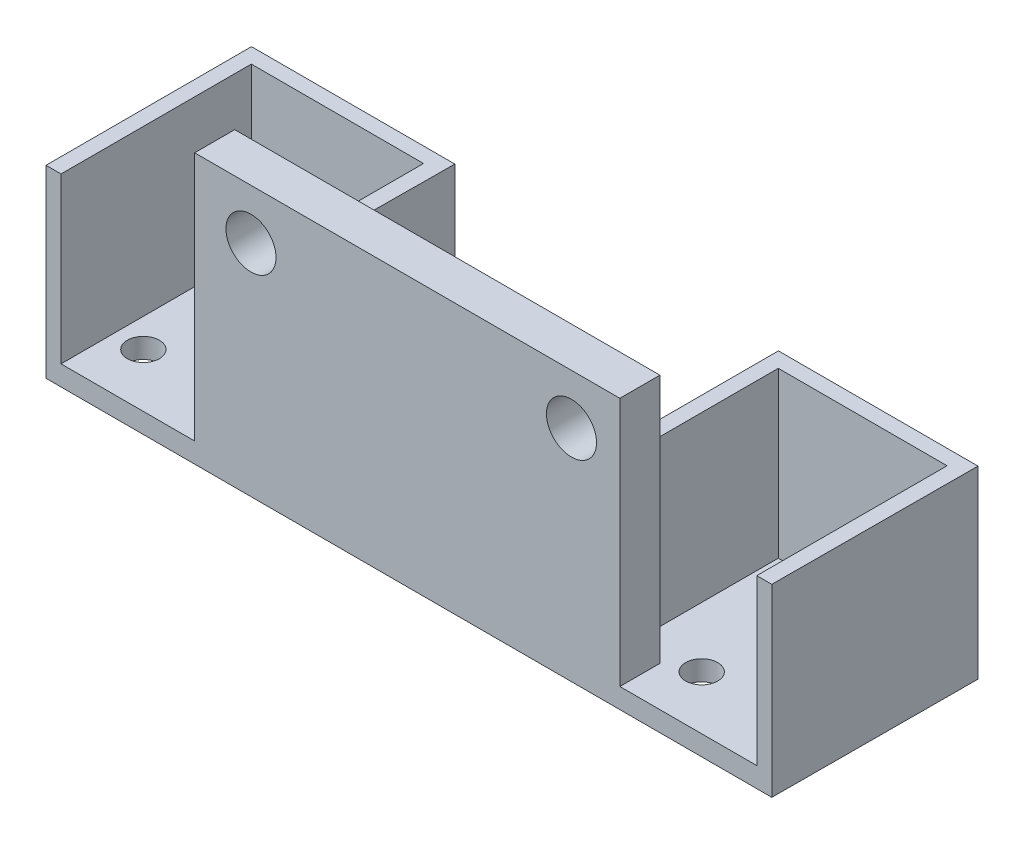
ISO-10303-21;
HEADER;
FILE_DESCRIPTION(('STEP AP214'),'2;1');
FILE_NAME('part.step','',(''),(''),'','','');
FILE_SCHEMA(('AUTOMOTIVE_DESIGN { 1 0 10303 214 1 1 1 1 }'));
ENDSEC;
DATA;
#1=APPLICATION_CONTEXT('core data for automotive mechanical design processes');
#2=APPLICATION_PROTOCOL_DEFINITION('international standard','automotive_design',2000,#1);
#3=PRODUCT_CONTEXT('',#1,'mechanical');
#4=PRODUCT('Part','Part','',(#3));
#5=PRODUCT_RELATED_PRODUCT_CATEGORY('part','',(#4));
#6=PRODUCT_DEFINITION_FORMATION('','',#4);
#7=PRODUCT_DEFINITION_CONTEXT('part definition',#1,'design');
#8=PRODUCT_DEFINITION('design','',#6,#7);
#9=PRODUCT_DEFINITION_SHAPE('','',#8);
#10=(LENGTH_UNIT() NAMED_UNIT(*) SI_UNIT(.MILLI.,.METRE.));
#11=(NAMED_UNIT(*) PLANE_ANGLE_UNIT() SI_UNIT($,.RADIAN.));
#12=(NAMED_UNIT(*) SI_UNIT($,.STERADIAN.) SOLID_ANGLE_UNIT());
#13=UNCERTAINTY_MEASURE_WITH_UNIT(LENGTH_MEASURE(1.E-05),#10,'distance_accuracy_value','');
#14=(GEOMETRIC_REPRESENTATION_CONTEXT(3) GLOBAL_UNCERTAINTY_ASSIGNED_CONTEXT((#13)) GLOBAL_UNIT_ASSIGNED_CONTEXT((#10,
#11,#12)) REPRESENTATION_CONTEXT('',''));
#15=CARTESIAN_POINT('',(0.,0.,0.));
#16=DIRECTION('',(0.,0.,1.));
#17=DIRECTION('',(1.,0.,0.));
#18=AXIS2_PLACEMENT_3D('',#15,#16,#17);
#19=CARTESIAN_POINT('',(0.,0.,6.));
#20=DIRECTION('',(0.,0.,1.));
#21=DIRECTION('',(1.,0.,0.));
#22=AXIS2_PLACEMENT_3D('',#19,#20,#21);
#23=PLANE('',#22);
#24=DIRECTION('',(0.,1.,0.));
#25=VECTOR('',#24,1.);
#26=CARTESIAN_POINT('',(9.99999999999998,-45.5,6.));
#27=LINE('',#26,#25);
#28=CARTESIAN_POINT('',(9.99999999999998,-35.9221877684383,6.));
#29=VERTEX_POINT('',#28);
#30=CARTESIAN_POINT('',(9.99999999999998,-17.5,6.));
#31=VERTEX_POINT('',#30);
#32=EDGE_CURVE('E383',#29,#31,#27,.T.);
#33=ORIENTED_EDGE('',*,*,#32,.T.);
#34=DIRECTION('',(-1.,0.,0.));
#35=VECTOR('',#34,1.);
#36=CARTESIAN_POINT('',(11.5,-17.5,6.));
#37=LINE('',#36,#35);
#38=CARTESIAN_POINT('',(8.49999999999998,-17.5,6.));
#39=VERTEX_POINT('',#38);
#40=EDGE_CURVE('E267',#31,#39,#37,.T.);
#41=ORIENTED_EDGE('',*,*,#40,.T.);
#42=DIRECTION('',(0.,-1.,0.));
#43=VECTOR('',#42,1.);
#44=CARTESIAN_POINT('',(8.49999999999998,-17.5,6.));
#45=LINE('',#44,#43);
#46=CARTESIAN_POINT('',(8.49999999999998,-33.9221877684383,6.));
#47=VERTEX_POINT('',#46);
#48=EDGE_CURVE('E261',#39,#47,#45,.T.);
#49=ORIENTED_EDGE('',*,*,#48,.T.);
#50=DIRECTION('',(-1.,0.,0.));
#51=VECTOR('',#50,1.);
#52=CARTESIAN_POINT('',(11.5,-33.9221877684383,6.));
#53=LINE('',#52,#51);
#54=CARTESIAN_POINT('',(-5.17053766501618,-33.9221877684383,6.));
#55=VERTEX_POINT('',#54);
#56=EDGE_CURVE('E258',#47,#55,#53,.T.);
#57=ORIENTED_EDGE('',*,*,#56,.T.);
#58=DIRECTION('',(0.,-1.,0.));
#59=VECTOR('',#58,1.);
#60=CARTESIAN_POINT('',(-5.17053766501618,0.,6.));
#61=LINE('',#60,#59);
#62=CARTESIAN_POINT('',(-5.17053766501618,-9.,6.));
#63=VERTEX_POINT('',#62);
#64=EDGE_CURVE('E285',#63,#55,#61,.T.);
#65=ORIENTED_EDGE('',*,*,#64,.F.);
#66=DIRECTION('',(-1.,0.,0.));
#67=VECTOR('',#66,1.);
#68=CARTESIAN_POINT('',(0.,-9.,6.));
#69=LINE('',#68,#67);
#70=CARTESIAN_POINT('',(-47.6233672567332,-9.,6.));
#71=VERTEX_POINT('',#70);
#72=EDGE_CURVE('E260',#63,#71,#69,.T.);
#73=ORIENTED_EDGE('',*,*,#72,.T.);
#74=DIRECTION('',(0.,-1.,0.));
#75=VECTOR('',#74,1.);
#76=CARTESIAN_POINT('',(-47.6233672567332,0.,6.));
#77=LINE('',#76,#75);
#78=CARTESIAN_POINT('',(-47.6233672567332,-33.9221877684383,6.));
#79=VERTEX_POINT('',#78);
#80=EDGE_CURVE('E296',#71,#79,#77,.T.);
#81=ORIENTED_EDGE('',*,*,#80,.T.);
#82=DIRECTION('',(-1.,0.,0.));
#83=VECTOR('',#82,1.);
#84=CARTESIAN_POINT('',(-40.7736847014026,-33.9221877684383,6.));
#85=LINE('',#84,#83);
#86=CARTESIAN_POINT('',(-60.9659308763604,-33.9221877684383,6.));
#87=VERTEX_POINT('',#86);
#88=EDGE_CURVE('E40',#79,#87,#85,.T.);
#89=ORIENTED_EDGE('',*,*,#88,.T.);
#90=DIRECTION('',(0.,1.,0.));
#91=VECTOR('',#90,1.);
#92=CARTESIAN_POINT('',(-60.9659308763604,-33.9221877684383,6.));
#93=LINE('',#92,#91);
#94=CARTESIAN_POINT('',(-60.9659308763604,-17.5,6.));
#95=VERTEX_POINT('',#94);
#96=EDGE_CURVE('E262',#87,#95,#93,.T.);
#97=ORIENTED_EDGE('',*,*,#96,.T.);
#98=DIRECTION('',(-1.,0.,0.));
#99=VECTOR('',#98,1.);
#100=CARTESIAN_POINT('',(-60.9659308763604,-17.5,6.));
#101=LINE('',#100,#99);
#102=CARTESIAN_POINT('',(-62.4659308763604,-17.5,6.));
#103=VERTEX_POINT('',#102);
#104=EDGE_CURVE('E265',#95,#103,#101,.T.);
#105=ORIENTED_EDGE('',*,*,#104,.T.);
#106=DIRECTION('',(0.,1.,0.));
#107=VECTOR('',#106,1.);
#108=CARTESIAN_POINT('',(-62.4659308763604,-45.5,6.));
#109=LINE('',#108,#107);
#110=CARTESIAN_POINT('',(-62.4659308763604,-35.9221877684383,6.));
#111=VERTEX_POINT('',#110);
#112=EDGE_CURVE('E45',#111,#103,#109,.T.);
#113=ORIENTED_EDGE('',*,*,#112,.F.);
#114=DIRECTION('',(-1.,0.,0.));
#115=VECTOR('',#114,1.);
#116=CARTESIAN_POINT('',(-40.7736847014026,-35.9221877684383,6.));
#117=LINE('',#116,#115);
#118=EDGE_CURVE('E182',#29,#111,#117,.T.);
#119=ORIENTED_EDGE('',*,*,#118,.F.);
#120=EDGE_LOOP('',(#33,#41,#49,#57,#65,#73,#81,#89,#97,#105,#113,#119));
#121=FACE_BOUND('',#120,.T.);
#122=CARTESIAN_POINT('',(-10.,-14.,6.));
#123=DIRECTION('',(0.,0.,1.));
#124=DIRECTION('',(1.,0.,0.));
#125=AXIS2_PLACEMENT_3D('',#122,#123,#124);
#126=CIRCLE('',#125,2.5);
#127=CARTESIAN_POINT('',(-7.5,-14.,6.));
#128=VERTEX_POINT('',#127);
#129=EDGE_CURVE('E199',#128,#128,#126,.F.);
#130=ORIENTED_EDGE('',*,*,#129,.T.);
#131=EDGE_LOOP('',(#130));
#132=FACE_BOUND('',#131,.T.);
#133=CARTESIAN_POINT('',(-42.,-14.,6.));
#134=DIRECTION('',(0.,0.,1.));
#135=DIRECTION('',(1.,0.,0.));
#136=AXIS2_PLACEMENT_3D('',#133,#134,#135);
#137=CIRCLE('',#136,2.5);
#138=CARTESIAN_POINT('',(-39.5,-14.,6.));
#139=VERTEX_POINT('',#138);
#140=EDGE_CURVE('E192',#139,#139,#137,.F.);
#141=ORIENTED_EDGE('',*,*,#140,.T.);
#142=EDGE_LOOP('',(#141));
#143=FACE_BOUND('',#142,.T.);
#144=ADVANCED_FACE('F36',(#121,#132,#143),#23,.T.);
#145=CARTESIAN_POINT('',(0.,-35.9221877684383,0.));
#146=DIRECTION('',(0.,-1.,0.));
#147=DIRECTION('',(0.,0.,-1.));
#148=AXIS2_PLACEMENT_3D('',#145,#146,#147);
#149=PLANE('',#148);
#150=DIRECTION('',(1.,0.,0.));
#151=VECTOR('',#150,1.);
#152=CARTESIAN_POINT('',(-40.7736847014026,-35.9221877684383,2.));
#153=LINE('',#152,#151);
#154=CARTESIAN_POINT('',(-42.2736847014026,-35.9221877684383,2.));
#155=VERTEX_POINT('',#154);
#156=CARTESIAN_POINT('',(-9.85494084252542,-35.9221877684383,2.));
#157=VERTEX_POINT('',#156);
#158=EDGE_CURVE('E184',#155,#157,#153,.T.);
#159=ORIENTED_EDGE('',*,*,#158,.T.);
#160=DIRECTION('',(0.,0.,1.));
#161=VECTOR('',#160,1.);
#162=CARTESIAN_POINT('',(-9.85494084252542,-35.9221877684383,0.));
#163=LINE('',#162,#161);
#164=CARTESIAN_POINT('',(-9.85494084252542,-35.9221877684383,-14.515404627564));
#165=VERTEX_POINT('',#164);
#166=EDGE_CURVE('E401',#165,#157,#163,.T.);
#167=ORIENTED_EDGE('',*,*,#166,.F.);
#168=DIRECTION('',(-1.,0.,0.));
#169=VECTOR('',#168,1.);
#170=CARTESIAN_POINT('',(0.,-35.9221877684383,-14.515404627564));
#171=LINE('',#170,#169);
#172=CARTESIAN_POINT('',(10.0714952975409,-35.9221877684383,-14.515404627564));
#173=VERTEX_POINT('',#172);
#174=EDGE_CURVE('E268',#173,#165,#171,.T.);
#175=ORIENTED_EDGE('',*,*,#174,.F.);
#176=DIRECTION('',(0.0034849355735506,0.,-0.999993927593587));
#177=VECTOR('',#176,1.);
#178=CARTESIAN_POINT('',(10.0207880387101,-35.9221877684383,0.0349220127717654));
#179=LINE('',#178,#177);
#180=EDGE_CURVE('E409',#29,#173,#179,.T.);
#181=ORIENTED_EDGE('',*,*,#180,.F.);
#182=ORIENTED_EDGE('',*,*,#118,.T.);
#183=DIRECTION('',(0.,0.,1.));
#184=VECTOR('',#183,1.);
#185=CARTESIAN_POINT('',(-62.4659308763604,-35.9221877684383,0.));
#186=LINE('',#185,#184);
#187=CARTESIAN_POINT('',(-62.4659308763604,-35.9221877684383,-14.515404627564));
#188=VERTEX_POINT('',#187);
#189=EDGE_CURVE('E177',#188,#111,#186,.T.);
#190=ORIENTED_EDGE('',*,*,#189,.F.);
#191=DIRECTION('',(-1.,0.,0.));
#192=VECTOR('',#191,1.);
#193=CARTESIAN_POINT('',(0.,-35.9221877684383,-14.515404627564));
#194=LINE('',#193,#192);
#195=CARTESIAN_POINT('',(-42.1602495844985,-35.9221877684383,-14.515404627564));
#196=VERTEX_POINT('',#195);
#197=EDGE_CURVE('E164',#196,#188,#194,.T.);
#198=ORIENTED_EDGE('',*,*,#197,.F.);
#199=DIRECTION('',(0.00686828109131985,0.,-0.999976413079254));
#200=VECTOR('',#199,1.);
#201=CARTESIAN_POINT('',(-42.2579542746405,-35.9221877684383,-0.290246354320128));
#202=LINE('',#201,#200);
#203=EDGE_CURVE('E207',#155,#196,#202,.T.);
#204=ORIENTED_EDGE('',*,*,#203,.F.);
#205=EDGE_LOOP('',(#159,#167,#175,#181,#182,#190,#198,#204));
#206=FACE_BOUND('',#205,.T.);
#207=CARTESIAN_POINT('',(-49.7736847014026,-35.9221877684383,0.643335212018568));
#208=DIRECTION('',(0.,-1.,0.));
#209=DIRECTION('',(0.,0.,-1.));
#210=AXIS2_PLACEMENT_3D('',#207,#208,#209);
#211=CIRCLE('',#210,1.6);
#212=CARTESIAN_POINT('',(-49.7736847014026,-35.9221877684383,-0.95666478798143));
#213=VERTEX_POINT('',#212);
#214=EDGE_CURVE('E209',#213,#213,#211,.T.);
#215=ORIENTED_EDGE('',*,*,#214,.F.);
#216=EDGE_LOOP('',(#215));
#217=FACE_BOUND('',#216,.T.);
#218=CARTESIAN_POINT('',(-58.1024837437839,-35.9221877684383,0.643335212018568));
#219=DIRECTION('',(0.,-1.,0.));
#220=DIRECTION('',(0.,0.,-1.));
#221=AXIS2_PLACEMENT_3D('',#218,#219,#220);
#222=CIRCLE('',#221,1.6);
#223=CARTESIAN_POINT('',(-58.1024837437839,-35.9221877684383,-0.95666478798143));
#224=VERTEX_POINT('',#223);
#225=EDGE_CURVE('E222',#224,#224,#222,.T.);
#226=ORIENTED_EDGE('',*,*,#225,.F.);
#227=EDGE_LOOP('',(#226));
#228=FACE_BOUND('',#227,.T.);
#229=CARTESIAN_POINT('',(5.49999999999998,-35.9221877684383,0.643335212018568));
#230=DIRECTION('',(0.,-1.,0.));
#231=DIRECTION('',(0.,0.,-1.));
#232=AXIS2_PLACEMENT_3D('',#229,#230,#231);
#233=CIRCLE('',#232,1.6);
#234=CARTESIAN_POINT('',(5.49999999999998,-35.9221877684383,-0.956664787981432));
#235=VERTEX_POINT('',#234);
#236=EDGE_CURVE('E203',#235,#235,#233,.T.);
#237=ORIENTED_EDGE('',*,*,#236,.F.);
#238=EDGE_LOOP('',(#237));
#239=FACE_BOUND('',#238,.T.);
#240=CARTESIAN_POINT('',(-2.35494084252542,-35.9221877684383,0.643335212018568));
#241=DIRECTION('',(0.,-1.,0.));
#242=DIRECTION('',(0.,0.,-1.));
#243=AXIS2_PLACEMENT_3D('',#240,#241,#242);
#244=CIRCLE('',#243,1.6);
#245=CARTESIAN_POINT('',(-2.35494084252542,-35.9221877684383,-0.956664787981432));
#246=VERTEX_POINT('',#245);
#247=EDGE_CURVE('E219',#246,#246,#244,.T.);
#248=ORIENTED_EDGE('',*,*,#247,.F.);
#249=EDGE_LOOP('',(#248));
#250=FACE_BOUND('',#249,.T.);
#251=ADVANCED_FACE('F412',(#206,#217,#228,#239,#250),#149,.T.);
#252=CARTESIAN_POINT('',(0.,-33.9221877684383,0.));
#253=DIRECTION('',(0.,-1.,0.));
#254=DIRECTION('',(0.,0.,-1.));
#255=AXIS2_PLACEMENT_3D('',#252,#253,#254);
#256=PLANE('',#255);
#257=CARTESIAN_POINT('',(5.49999999999998,-33.9221877684383,0.643335212018568));
#258=DIRECTION('',(0.,-1.,0.));
#259=DIRECTION('',(0.,0.,-1.));
#260=AXIS2_PLACEMENT_3D('',#257,#258,#259);
#261=CIRCLE('',#260,1.6);
#262=CARTESIAN_POINT('',(5.49999999999998,-33.9221877684383,-0.956664787981432));
#263=VERTEX_POINT('',#262);
#264=EDGE_CURVE('E183',#263,#263,#261,.T.);
#265=ORIENTED_EDGE('',*,*,#264,.T.);
#266=EDGE_LOOP('',(#265));
#267=FACE_BOUND('',#266,.T.);
#268=CARTESIAN_POINT('',(-2.35494084252542,-33.9221877684383,0.643335212018568));
#269=DIRECTION('',(0.,-1.,0.));
#270=DIRECTION('',(0.,0.,-1.));
#271=AXIS2_PLACEMENT_3D('',#268,#269,#270);
#272=CIRCLE('',#271,1.6);
#273=CARTESIAN_POINT('',(-2.35494084252542,-33.9221877684383,-0.956664787981432));
#274=VERTEX_POINT('',#273);
#275=EDGE_CURVE('E189',#274,#274,#272,.T.);
#276=ORIENTED_EDGE('',*,*,#275,.T.);
#277=EDGE_LOOP('',(#276));
#278=FACE_BOUND('',#277,.T.);
#279=ORIENTED_EDGE('',*,*,#56,.F.);
#280=DIRECTION('',(0.,0.,-1.));
#281=VECTOR('',#280,1.);
#282=CARTESIAN_POINT('',(8.49999999999998,-33.9221877684383,-13.));
#283=LINE('',#282,#281);
#284=CARTESIAN_POINT('',(8.49999999999998,-33.9221877684383,-13.));
#285=VERTEX_POINT('',#284);
#286=EDGE_CURVE('E250',#47,#285,#283,.T.);
#287=ORIENTED_EDGE('',*,*,#286,.T.);
#288=DIRECTION('',(1.,0.,0.));
#289=VECTOR('',#288,1.);
#290=CARTESIAN_POINT('',(-80.6598893973896,-33.9221877684383,-13.));
#291=LINE('',#290,#289);
#292=CARTESIAN_POINT('',(-8.35494084252542,-33.9221877684383,-13.));
#293=VERTEX_POINT('',#292);
#294=EDGE_CURVE('E359',#293,#285,#291,.T.);
#295=ORIENTED_EDGE('',*,*,#294,.F.);
#296=DIRECTION('',(0.,0.,1.));
#297=VECTOR('',#296,1.);
#298=CARTESIAN_POINT('',(-8.35494084252542,-33.9221877684383,-13.));
#299=LINE('',#298,#297);
#300=CARTESIAN_POINT('',(-8.35494084252542,-33.9221877684383,2.));
#301=VERTEX_POINT('',#300);
#302=EDGE_CURVE('E245',#293,#301,#299,.T.);
#303=ORIENTED_EDGE('',*,*,#302,.T.);
#304=DIRECTION('',(1.,0.,0.));
#305=VECTOR('',#304,1.);
#306=CARTESIAN_POINT('',(0.,-33.9221877684383,2.));
#307=LINE('',#306,#305);
#308=CARTESIAN_POINT('',(-5.17053766501618,-33.9221877684383,2.));
#309=VERTEX_POINT('',#308);
#310=EDGE_CURVE('E239',#301,#309,#307,.T.);
#311=ORIENTED_EDGE('',*,*,#310,.T.);
#312=DIRECTION('',(0.,0.,-1.));
#313=VECTOR('',#312,1.);
#314=CARTESIAN_POINT('',(-5.17053766501618,-33.9221877684383,6.));
#315=LINE('',#314,#313);
#316=EDGE_CURVE('E253',#55,#309,#315,.T.);
#317=ORIENTED_EDGE('',*,*,#316,.F.);
#318=EDGE_LOOP('',(#279,#287,#295,#303,#311,#317));
#319=FACE_BOUND('',#318,.T.);
#320=ADVANCED_FACE('F280',(#267,#278,#319),#256,.F.);
#321=CARTESIAN_POINT('',(0.,-33.9221877684383,0.));
#322=DIRECTION('',(0.,-1.,0.));
#323=DIRECTION('',(0.,0.,-1.));
#324=AXIS2_PLACEMENT_3D('',#321,#322,#323);
#325=PLANE('',#324);
#326=CARTESIAN_POINT('',(-49.7736847014026,-33.9221877684383,0.643335212018568));
#327=DIRECTION('',(0.,-1.,0.));
#328=DIRECTION('',(0.,0.,-1.));
#329=AXIS2_PLACEMENT_3D('',#326,#327,#328);
#330=CIRCLE('',#329,1.6);
#331=CARTESIAN_POINT('',(-49.7736847014026,-33.9221877684383,-0.95666478798143));
#332=VERTEX_POINT('',#331);
#333=EDGE_CURVE('E237',#332,#332,#330,.T.);
#334=ORIENTED_EDGE('',*,*,#333,.T.);
#335=EDGE_LOOP('',(#334));
#336=FACE_BOUND('',#335,.T.);
#337=CARTESIAN_POINT('',(-58.1024837437839,-33.9221877684383,0.643335212018568));
#338=DIRECTION('',(0.,-1.,0.));
#339=DIRECTION('',(0.,0.,-1.));
#340=AXIS2_PLACEMENT_3D('',#337,#338,#339);
#341=CIRCLE('',#340,1.6);
#342=CARTESIAN_POINT('',(-58.1024837437839,-33.9221877684383,-0.95666478798143));
#343=VERTEX_POINT('',#342);
#344=EDGE_CURVE('E235',#343,#343,#341,.T.);
#345=ORIENTED_EDGE('',*,*,#344,.T.);
#346=EDGE_LOOP('',(#345));
#347=FACE_BOUND('',#346,.T.);
#348=DIRECTION('',(0.,0.,1.));
#349=VECTOR('',#348,1.);
#350=CARTESIAN_POINT('',(-60.9659308763604,-33.9221877684383,-13.));
#351=LINE('',#350,#349);
#352=CARTESIAN_POINT('',(-60.9659308763604,-33.9221877684383,-13.));
#353=VERTEX_POINT('',#352);
#354=EDGE_CURVE('E243',#353,#87,#351,.T.);
#355=ORIENTED_EDGE('',*,*,#354,.T.);
#356=ORIENTED_EDGE('',*,*,#88,.F.);
#357=DIRECTION('',(0.,0.,-1.));
#358=VECTOR('',#357,1.);
#359=CARTESIAN_POINT('',(-47.6233672567332,-33.9221877684383,6.));
#360=LINE('',#359,#358);
#361=CARTESIAN_POINT('',(-47.6233672567332,-33.9221877684383,2.));
#362=VERTEX_POINT('',#361);
#363=EDGE_CURVE('E319',#79,#362,#360,.T.);
#364=ORIENTED_EDGE('',*,*,#363,.T.);
#365=DIRECTION('',(1.,0.,0.));
#366=VECTOR('',#365,1.);
#367=CARTESIAN_POINT('',(0.,-33.9221877684383,2.));
#368=LINE('',#367,#366);
#369=CARTESIAN_POINT('',(-43.7736847014026,-33.9221877684383,2.));
#370=VERTEX_POINT('',#369);
#371=EDGE_CURVE('E321',#362,#370,#368,.T.);
#372=ORIENTED_EDGE('',*,*,#371,.T.);
#373=DIRECTION('',(0.,0.,-1.));
#374=VECTOR('',#373,1.);
#375=CARTESIAN_POINT('',(-43.7736847014026,-33.9221877684383,-13.));
#376=LINE('',#375,#374);
#377=CARTESIAN_POINT('',(-43.7736847014026,-33.9221877684383,-13.));
#378=VERTEX_POINT('',#377);
#379=EDGE_CURVE('E323',#370,#378,#376,.T.);
#380=ORIENTED_EDGE('',*,*,#379,.T.);
#381=EDGE_CURVE('E231',#353,#378,#291,.T.);
#382=ORIENTED_EDGE('',*,*,#381,.F.);
#383=EDGE_LOOP('',(#355,#356,#364,#372,#380,#382));
#384=FACE_BOUND('',#383,.T.);
#385=ADVANCED_FACE('F38',(#336,#347,#384),#325,.F.);
#386=CARTESIAN_POINT('',(0.,0.,2.));
#387=DIRECTION('',(0.,0.,1.));
#388=DIRECTION('',(1.,0.,0.));
#389=AXIS2_PLACEMENT_3D('',#386,#387,#388);
#390=PLANE('',#389);
#391=ORIENTED_EDGE('',*,*,#158,.F.);
#392=DIRECTION('',(0.,1.,0.));
#393=VECTOR('',#392,1.);
#394=CARTESIAN_POINT('',(-42.2736847014026,-45.5,2.));
#395=LINE('',#394,#393);
#396=CARTESIAN_POINT('',(-42.2736847014026,-17.5,2.));
#397=VERTEX_POINT('',#396);
#398=EDGE_CURVE('E208',#155,#397,#395,.T.);
#399=ORIENTED_EDGE('',*,*,#398,.T.);
#400=DIRECTION('',(1.,0.,0.));
#401=VECTOR('',#400,1.);
#402=CARTESIAN_POINT('',(-60.9659308763604,-17.5,2.));
#403=LINE('',#402,#401);
#404=CARTESIAN_POINT('',(-43.7736847014026,-17.5,2.));
#405=VERTEX_POINT('',#404);
#406=EDGE_CURVE('E314',#405,#397,#403,.T.);
#407=ORIENTED_EDGE('',*,*,#406,.F.);
#408=DIRECTION('',(0.,1.,0.));
#409=VECTOR('',#408,1.);
#410=CARTESIAN_POINT('',(-43.7736847014026,-17.5,2.));
#411=LINE('',#410,#409);
#412=EDGE_CURVE('E308',#370,#405,#411,.T.);
#413=ORIENTED_EDGE('',*,*,#412,.F.);
#414=ORIENTED_EDGE('',*,*,#371,.F.);
#415=DIRECTION('',(0.,-1.,0.));
#416=VECTOR('',#415,1.);
#417=CARTESIAN_POINT('',(-47.6233672567332,0.,2.));
#418=LINE('',#417,#416);
#419=CARTESIAN_POINT('',(-47.6233672567332,-9.,2.));
#420=VERTEX_POINT('',#419);
#421=EDGE_CURVE('E305',#420,#362,#418,.T.);
#422=ORIENTED_EDGE('',*,*,#421,.F.);
#423=DIRECTION('',(-1.,0.,0.));
#424=VECTOR('',#423,1.);
#425=CARTESIAN_POINT('',(0.,-9.,2.));
#426=LINE('',#425,#424);
#427=CARTESIAN_POINT('',(-5.17053766501618,-9.,2.));
#428=VERTEX_POINT('',#427);
#429=EDGE_CURVE('E301',#428,#420,#426,.T.);
#430=ORIENTED_EDGE('',*,*,#429,.F.);
#431=DIRECTION('',(0.,-1.,0.));
#432=VECTOR('',#431,1.);
#433=CARTESIAN_POINT('',(-5.17053766501618,0.,2.));
#434=LINE('',#433,#432);
#435=EDGE_CURVE('E289',#428,#309,#434,.T.);
#436=ORIENTED_EDGE('',*,*,#435,.T.);
#437=ORIENTED_EDGE('',*,*,#310,.F.);
#438=DIRECTION('',(0.,-1.,0.));
#439=VECTOR('',#438,1.);
#440=CARTESIAN_POINT('',(-8.35494084252542,-33.926569964251,2.));
#441=LINE('',#440,#439);
#442=CARTESIAN_POINT('',(-8.35494084252542,-17.5,2.));
#443=VERTEX_POINT('',#442);
#444=EDGE_CURVE('E287',#443,#301,#441,.T.);
#445=ORIENTED_EDGE('',*,*,#444,.F.);
#446=CARTESIAN_POINT('',(-9.85494084252542,-17.5,2.));
#447=VERTEX_POINT('',#446);
#448=EDGE_CURVE('E315',#447,#443,#403,.T.);
#449=ORIENTED_EDGE('',*,*,#448,.F.);
#450=DIRECTION('',(0.,1.,0.));
#451=VECTOR('',#450,1.);
#452=CARTESIAN_POINT('',(-9.85494084252542,-45.5,2.));
#453=LINE('',#452,#451);
#454=EDGE_CURVE('E410',#157,#447,#453,.T.);
#455=ORIENTED_EDGE('',*,*,#454,.F.);
#456=EDGE_LOOP('',(#391,#399,#407,#413,#414,#422,#430,#436,#437,#445,#449,#455));
#457=FACE_BOUND('',#456,.T.);
#458=CARTESIAN_POINT('',(-42.,-14.,2.));
#459=DIRECTION('',(0.,0.,-1.));
#460=DIRECTION('',(-1.,0.,0.));
#461=AXIS2_PLACEMENT_3D('',#458,#459,#460);
#462=CIRCLE('',#461,2.5);
#463=CARTESIAN_POINT('',(-44.5,-14.,2.));
#464=VERTEX_POINT('',#463);
#465=EDGE_CURVE('E291',#464,#464,#462,.F.);
#466=ORIENTED_EDGE('',*,*,#465,.T.);
#467=EDGE_LOOP('',(#466));
#468=FACE_BOUND('',#467,.T.);
#469=CARTESIAN_POINT('',(-10.,-14.,2.));
#470=DIRECTION('',(0.,0.,-1.));
#471=DIRECTION('',(-1.,0.,0.));
#472=AXIS2_PLACEMENT_3D('',#469,#470,#471);
#473=CIRCLE('',#472,2.5);
#474=CARTESIAN_POINT('',(-12.5,-14.,2.));
#475=VERTEX_POINT('',#474);
#476=EDGE_CURVE('E304',#475,#475,#473,.T.);
#477=ORIENTED_EDGE('',*,*,#476,.F.);
#478=EDGE_LOOP('',(#477));
#479=FACE_BOUND('',#478,.T.);
#480=ADVANCED_FACE('F345',(#457,#468,#479),#390,.F.);
#481=CARTESIAN_POINT('',(-5.17053766501618,0.,6.));
#482=DIRECTION('',(1.,0.,0.));
#483=DIRECTION('',(0.,0.,-1.));
#484=AXIS2_PLACEMENT_3D('',#481,#482,#483);
#485=PLANE('',#484);
#486=ORIENTED_EDGE('',*,*,#64,.T.);
#487=ORIENTED_EDGE('',*,*,#316,.T.);
#488=ORIENTED_EDGE('',*,*,#435,.F.);
#489=DIRECTION('',(0.,0.,-1.));
#490=VECTOR('',#489,1.);
#491=CARTESIAN_POINT('',(-5.17053766501618,-9.,6.));
#492=LINE('',#491,#490);
#493=EDGE_CURVE('E303',#63,#428,#492,.T.);
#494=ORIENTED_EDGE('',*,*,#493,.F.);
#495=EDGE_LOOP('',(#486,#487,#488,#494));
#496=FACE_BOUND('',#495,.T.);
#497=ADVANCED_FACE('F435',(#496),#485,.T.);
#498=CARTESIAN_POINT('',(-8.35494084252542,-33.926569964251,-13.));
#499=DIRECTION('',(-1.,0.,0.));
#500=DIRECTION('',(0.,0.,1.));
#501=AXIS2_PLACEMENT_3D('',#498,#499,#500);
#502=PLANE('',#501);
#503=ORIENTED_EDGE('',*,*,#302,.F.);
#504=DIRECTION('',(0.,-1.,0.));
#505=VECTOR('',#504,1.);
#506=CARTESIAN_POINT('',(-8.35494084252542,-33.926569964251,-13.));
#507=LINE('',#506,#505);
#508=CARTESIAN_POINT('',(-8.35494084252542,-17.5,-13.));
#509=VERTEX_POINT('',#508);
#510=EDGE_CURVE('E358',#509,#293,#507,.T.);
#511=ORIENTED_EDGE('',*,*,#510,.F.);
#512=DIRECTION('',(0.,0.,1.));
#513=VECTOR('',#512,1.);
#514=CARTESIAN_POINT('',(-8.35494084252542,-17.5,-13.));
#515=LINE('',#514,#513);
#516=EDGE_CURVE('E284',#509,#443,#515,.T.);
#517=ORIENTED_EDGE('',*,*,#516,.T.);
#518=ORIENTED_EDGE('',*,*,#444,.T.);
#519=EDGE_LOOP('',(#503,#511,#517,#518));
#520=FACE_BOUND('',#519,.T.);
#521=ADVANCED_FACE('F367',(#520),#502,.F.);
#522=CARTESIAN_POINT('',(8.49999999999998,-17.5,-13.));
#523=DIRECTION('',(1.,0.,0.));
#524=DIRECTION('',(0.,1.,0.));
#525=AXIS2_PLACEMENT_3D('',#522,#523,#524);
#526=PLANE('',#525);
#527=ORIENTED_EDGE('',*,*,#286,.F.);
#528=ORIENTED_EDGE('',*,*,#48,.F.);
#529=DIRECTION('',(0.,0.,1.));
#530=VECTOR('',#529,1.);
#531=CARTESIAN_POINT('',(8.49999999999998,-17.5,-13.));
#532=LINE('',#531,#530);
#533=CARTESIAN_POINT('',(8.49999999999998,-17.5,-13.));
#534=VERTEX_POINT('',#533);
#535=EDGE_CURVE('E360',#534,#39,#532,.T.);
#536=ORIENTED_EDGE('',*,*,#535,.F.);
#537=DIRECTION('',(0.,1.,0.));
#538=VECTOR('',#537,1.);
#539=CARTESIAN_POINT('',(8.49999999999998,-17.5,-13.));
#540=LINE('',#539,#538);
#541=EDGE_CURVE('E355',#285,#534,#540,.T.);
#542=ORIENTED_EDGE('',*,*,#541,.F.);
#543=EDGE_LOOP('',(#527,#528,#536,#542));
#544=FACE_BOUND('',#543,.T.);
#545=ADVANCED_FACE('F426',(#544),#526,.F.);
#546=CARTESIAN_POINT('',(-47.6233672567332,0.,6.));
#547=DIRECTION('',(1.,0.,0.));
#548=DIRECTION('',(0.,1.,0.));
#549=AXIS2_PLACEMENT_3D('',#546,#547,#548);
#550=PLANE('',#549);
#551=ORIENTED_EDGE('',*,*,#363,.F.);
#552=ORIENTED_EDGE('',*,*,#80,.F.);
#553=DIRECTION('',(0.,0.,-1.));
#554=VECTOR('',#553,1.);
#555=CARTESIAN_POINT('',(-47.6233672567332,-9.,6.));
#556=LINE('',#555,#554);
#557=EDGE_CURVE('E309',#71,#420,#556,.T.);
#558=ORIENTED_EDGE('',*,*,#557,.T.);
#559=ORIENTED_EDGE('',*,*,#421,.T.);
#560=EDGE_LOOP('',(#551,#552,#558,#559));
#561=FACE_BOUND('',#560,.T.);
#562=ADVANCED_FACE('F340',(#561),#550,.F.);
#563=CARTESIAN_POINT('',(-43.7736847014026,-17.5,-13.));
#564=DIRECTION('',(1.,0.,0.));
#565=DIRECTION('',(0.,1.,0.));
#566=AXIS2_PLACEMENT_3D('',#563,#564,#565);
#567=PLANE('',#566);
#568=ORIENTED_EDGE('',*,*,#379,.F.);
#569=ORIENTED_EDGE('',*,*,#412,.T.);
#570=DIRECTION('',(0.,0.,1.));
#571=VECTOR('',#570,1.);
#572=CARTESIAN_POINT('',(-43.7736847014026,-17.5,-13.));
#573=LINE('',#572,#571);
#574=CARTESIAN_POINT('',(-43.7736847014026,-17.5,-13.));
#575=VERTEX_POINT('',#574);
#576=EDGE_CURVE('E318',#575,#405,#573,.T.);
#577=ORIENTED_EDGE('',*,*,#576,.F.);
#578=DIRECTION('',(0.,1.,0.));
#579=VECTOR('',#578,1.);
#580=CARTESIAN_POINT('',(-43.7736847014026,-17.5,-13.));
#581=LINE('',#580,#579);
#582=EDGE_CURVE('E226',#378,#575,#581,.T.);
#583=ORIENTED_EDGE('',*,*,#582,.F.);
#584=EDGE_LOOP('',(#568,#569,#577,#583));
#585=FACE_BOUND('',#584,.T.);
#586=ADVANCED_FACE('F433',(#585),#567,.F.);
#587=CARTESIAN_POINT('',(-60.9659308763604,-17.5,-13.));
#588=DIRECTION('',(-1.,0.,0.));
#589=DIRECTION('',(0.,0.,1.));
#590=AXIS2_PLACEMENT_3D('',#587,#588,#589);
#591=PLANE('',#590);
#592=ORIENTED_EDGE('',*,*,#354,.F.);
#593=DIRECTION('',(0.,-1.,0.));
#594=VECTOR('',#593,1.);
#595=CARTESIAN_POINT('',(-60.9659308763604,-17.5,-13.));
#596=LINE('',#595,#594);
#597=CARTESIAN_POINT('',(-60.9659308763604,-17.5,-13.));
#598=VERTEX_POINT('',#597);
#599=EDGE_CURVE('E363',#598,#353,#596,.T.);
#600=ORIENTED_EDGE('',*,*,#599,.F.);
#601=DIRECTION('',(0.,0.,1.));
#602=VECTOR('',#601,1.);
#603=CARTESIAN_POINT('',(-60.9659308763604,-17.5,-13.));
#604=LINE('',#603,#602);
#605=EDGE_CURVE('E335',#598,#95,#604,.T.);
#606=ORIENTED_EDGE('',*,*,#605,.T.);
#607=ORIENTED_EDGE('',*,*,#96,.F.);
#608=EDGE_LOOP('',(#592,#600,#606,#607));
#609=FACE_BOUND('',#608,.T.);
#610=ADVANCED_FACE('F333',(#609),#591,.F.);
#611=CARTESIAN_POINT('',(-10.,-14.,2.));
#612=DIRECTION('',(0.,0.,-1.));
#613=DIRECTION('',(-1.,0.,0.));
#614=AXIS2_PLACEMENT_3D('',#611,#612,#613);
#615=CYLINDRICAL_SURFACE('',#614,2.5);
#616=ORIENTED_EDGE('',*,*,#129,.F.);
#617=EDGE_LOOP('',(#616));
#618=FACE_BOUND('',#617,.T.);
#619=ORIENTED_EDGE('',*,*,#476,.T.);
#620=EDGE_LOOP('',(#619));
#621=FACE_BOUND('',#620,.T.);
#622=ADVANCED_FACE('F469',(#618,#621),#615,.F.);
#623=CARTESIAN_POINT('',(-42.,-14.,2.));
#624=DIRECTION('',(0.,0.,-1.));
#625=DIRECTION('',(-1.,0.,0.));
#626=AXIS2_PLACEMENT_3D('',#623,#624,#625);
#627=CYLINDRICAL_SURFACE('',#626,2.5);
#628=ORIENTED_EDGE('',*,*,#140,.F.);
#629=EDGE_LOOP('',(#628));
#630=FACE_BOUND('',#629,.T.);
#631=ORIENTED_EDGE('',*,*,#465,.F.);
#632=EDGE_LOOP('',(#631));
#633=FACE_BOUND('',#632,.T.);
#634=ADVANCED_FACE('F472',(#630,#633),#627,.F.);
#635=CARTESIAN_POINT('',(-39.,-9.,10.));
#636=DIRECTION('',(0.,-1.,0.));
#637=DIRECTION('',(0.,0.,-1.));
#638=AXIS2_PLACEMENT_3D('',#635,#636,#637);
#639=PLANE('',#638);
#640=ORIENTED_EDGE('',*,*,#429,.T.);
#641=ORIENTED_EDGE('',*,*,#557,.F.);
#642=ORIENTED_EDGE('',*,*,#72,.F.);
#643=ORIENTED_EDGE('',*,*,#493,.T.);
#644=EDGE_LOOP('',(#640,#641,#642,#643));
#645=FACE_BOUND('',#644,.T.);
#646=ADVANCED_FACE('F476',(#645),#639,.F.);
#647=CARTESIAN_POINT('',(-8.35494084252542,-17.5,-13.));
#648=DIRECTION('',(0.,-1.,0.));
#649=DIRECTION('',(0.,0.,-1.));
#650=AXIS2_PLACEMENT_3D('',#647,#648,#649);
#651=PLANE('',#650);
#652=ORIENTED_EDGE('',*,*,#406,.T.);
#653=DIRECTION('',(-0.00686828109131985,0.,0.999976413079254));
#654=VECTOR('',#653,1.);
#655=CARTESIAN_POINT('',(-42.2579542746405,-17.5,-0.290246354320128));
#656=LINE('',#655,#654);
#657=CARTESIAN_POINT('',(-42.1602495844985,-17.5,-14.515404627564));
#658=VERTEX_POINT('',#657);
#659=EDGE_CURVE('E176',#658,#397,#656,.T.);
#660=ORIENTED_EDGE('',*,*,#659,.F.);
#661=DIRECTION('',(1.,0.,0.));
#662=VECTOR('',#661,1.);
#663=CARTESIAN_POINT('',(0.,-17.5,-14.515404627564));
#664=LINE('',#663,#662);
#665=CARTESIAN_POINT('',(-62.4659308763604,-17.5,-14.515404627564));
#666=VERTEX_POINT('',#665);
#667=EDGE_CURVE('E161',#666,#658,#664,.T.);
#668=ORIENTED_EDGE('',*,*,#667,.F.);
#669=DIRECTION('',(0.,0.,-1.));
#670=VECTOR('',#669,1.);
#671=CARTESIAN_POINT('',(-62.4659308763604,-17.5,0.));
#672=LINE('',#671,#670);
#673=EDGE_CURVE('E11',#103,#666,#672,.T.);
#674=ORIENTED_EDGE('',*,*,#673,.F.);
#675=ORIENTED_EDGE('',*,*,#104,.F.);
#676=ORIENTED_EDGE('',*,*,#605,.F.);
#677=DIRECTION('',(1.,0.,0.));
#678=VECTOR('',#677,1.);
#679=CARTESIAN_POINT('',(-80.6598893973896,-17.5,-13.));
#680=LINE('',#679,#678);
#681=EDGE_CURVE('E354',#598,#575,#680,.T.);
#682=ORIENTED_EDGE('',*,*,#681,.T.);
#683=ORIENTED_EDGE('',*,*,#576,.T.);
#684=EDGE_LOOP('',(#652,#660,#668,#674,#675,#676,#682,#683));
#685=FACE_BOUND('',#684,.T.);
#686=ADVANCED_FACE('F174',(#685),#651,.F.);
#687=DIRECTION('',(1.,0.,0.));
#688=VECTOR('',#687,1.);
#689=CARTESIAN_POINT('',(0.,-17.5,-14.515404627564));
#690=LINE('',#689,#688);
#691=CARTESIAN_POINT('',(-9.85494084252542,-17.5,-14.515404627564));
#692=VERTEX_POINT('',#691);
#693=CARTESIAN_POINT('',(10.0714952975409,-17.5,-14.515404627564));
#694=VERTEX_POINT('',#693);
#695=EDGE_CURVE('E53',#692,#694,#690,.T.);
#696=ORIENTED_EDGE('',*,*,#695,.F.);
#697=DIRECTION('',(0.,0.,-1.));
#698=VECTOR('',#697,1.);
#699=CARTESIAN_POINT('',(-9.85494084252542,-17.5,0.));
#700=LINE('',#699,#698);
#701=EDGE_CURVE('E408',#447,#692,#700,.T.);
#702=ORIENTED_EDGE('',*,*,#701,.F.);
#703=ORIENTED_EDGE('',*,*,#448,.T.);
#704=ORIENTED_EDGE('',*,*,#516,.F.);
#705=EDGE_CURVE('E317',#509,#534,#680,.T.);
#706=ORIENTED_EDGE('',*,*,#705,.T.);
#707=ORIENTED_EDGE('',*,*,#535,.T.);
#708=ORIENTED_EDGE('',*,*,#40,.F.);
#709=DIRECTION('',(-0.0034849355735506,0.,0.999993927593587));
#710=VECTOR('',#709,1.);
#711=CARTESIAN_POINT('',(10.0207880387101,-17.5,0.0349220127717654));
#712=LINE('',#711,#710);
#713=EDGE_CURVE('E644',#694,#31,#712,.T.);
#714=ORIENTED_EDGE('',*,*,#713,.F.);
#715=EDGE_LOOP('',(#696,#702,#703,#704,#706,#707,#708,#714));
#716=FACE_BOUND('',#715,.T.);
#717=ADVANCED_FACE('F424',(#716),#651,.F.);
#718=CARTESIAN_POINT('',(-80.6598893973896,-17.5,-13.));
#719=DIRECTION('',(0.,0.,1.));
#720=DIRECTION('',(1.,0.,0.));
#721=AXIS2_PLACEMENT_3D('',#718,#719,#720);
#722=PLANE('',#721);
#723=ORIENTED_EDGE('',*,*,#294,.T.);
#724=ORIENTED_EDGE('',*,*,#541,.T.);
#725=ORIENTED_EDGE('',*,*,#705,.F.);
#726=ORIENTED_EDGE('',*,*,#510,.T.);
#727=EDGE_LOOP('',(#723,#724,#725,#726));
#728=FACE_BOUND('',#727,.T.);
#729=ADVANCED_FACE('F425',(#728),#722,.T.);
#730=ORIENTED_EDGE('',*,*,#681,.F.);
#731=ORIENTED_EDGE('',*,*,#599,.T.);
#732=ORIENTED_EDGE('',*,*,#381,.T.);
#733=ORIENTED_EDGE('',*,*,#582,.T.);
#734=EDGE_LOOP('',(#730,#731,#732,#733));
#735=FACE_BOUND('',#734,.T.);
#736=ADVANCED_FACE('F377',(#735),#722,.T.);
#737=CARTESIAN_POINT('',(-58.1024837437839,-25.9221877684383,0.643335212018568));
#738=DIRECTION('',(0.,-1.,0.));
#739=DIRECTION('',(0.,0.,-1.));
#740=AXIS2_PLACEMENT_3D('',#737,#738,#739);
#741=CYLINDRICAL_SURFACE('',#740,1.6);
#742=ORIENTED_EDGE('',*,*,#225,.T.);
#743=EDGE_LOOP('',(#742));
#744=FACE_BOUND('',#743,.T.);
#745=ORIENTED_EDGE('',*,*,#344,.F.);
#746=EDGE_LOOP('',(#745));
#747=FACE_BOUND('',#746,.T.);
#748=ADVANCED_FACE('F461',(#744,#747),#741,.F.);
#749=CARTESIAN_POINT('',(-2.35494084252542,-25.9221877684383,0.643335212018568));
#750=DIRECTION('',(0.,-1.,0.));
#751=DIRECTION('',(0.,0.,-1.));
#752=AXIS2_PLACEMENT_3D('',#749,#750,#751);
#753=CYLINDRICAL_SURFACE('',#752,1.6);
#754=ORIENTED_EDGE('',*,*,#247,.T.);
#755=EDGE_LOOP('',(#754));
#756=FACE_BOUND('',#755,.T.);
#757=ORIENTED_EDGE('',*,*,#275,.F.);
#758=EDGE_LOOP('',(#757));
#759=FACE_BOUND('',#758,.T.);
#760=ADVANCED_FACE('F457',(#756,#759),#753,.F.);
#761=CARTESIAN_POINT('',(5.49999999999998,-25.9221877684383,0.643335212018568));
#762=DIRECTION('',(0.,-1.,0.));
#763=DIRECTION('',(0.,0.,-1.));
#764=AXIS2_PLACEMENT_3D('',#761,#762,#763);
#765=CYLINDRICAL_SURFACE('',#764,1.6);
#766=ORIENTED_EDGE('',*,*,#236,.T.);
#767=EDGE_LOOP('',(#766));
#768=FACE_BOUND('',#767,.T.);
#769=ORIENTED_EDGE('',*,*,#264,.F.);
#770=EDGE_LOOP('',(#769));
#771=FACE_BOUND('',#770,.T.);
#772=ADVANCED_FACE('F454',(#768,#771),#765,.F.);
#773=CARTESIAN_POINT('',(-49.7736847014026,-25.9221877684383,0.643335212018568));
#774=DIRECTION('',(0.,-1.,0.));
#775=DIRECTION('',(0.,0.,-1.));
#776=AXIS2_PLACEMENT_3D('',#773,#774,#775);
#777=CYLINDRICAL_SURFACE('',#776,1.6);
#778=ORIENTED_EDGE('',*,*,#214,.T.);
#779=EDGE_LOOP('',(#778));
#780=FACE_BOUND('',#779,.T.);
#781=ORIENTED_EDGE('',*,*,#333,.F.);
#782=EDGE_LOOP('',(#781));
#783=FACE_BOUND('',#782,.T.);
#784=ADVANCED_FACE('F448',(#780,#783),#777,.F.);
#785=CARTESIAN_POINT('',(-42.2579542746405,-45.5,-0.290246354320128));
#786=DIRECTION('',(-0.999976413079254,0.,-0.00686828109131985));
#787=DIRECTION('',(-0.00686828109131985,0.,0.999976413079254));
#788=AXIS2_PLACEMENT_3D('',#785,#786,#787);
#789=PLANE('',#788);
#790=ORIENTED_EDGE('',*,*,#203,.T.);
#791=DIRECTION('',(0.,1.,0.));
#792=VECTOR('',#791,1.);
#793=CARTESIAN_POINT('',(-42.1602495844985,-45.5,-14.515404627564));
#794=LINE('',#793,#792);
#795=EDGE_CURVE('E206',#196,#658,#794,.T.);
#796=ORIENTED_EDGE('',*,*,#795,.T.);
#797=ORIENTED_EDGE('',*,*,#659,.T.);
#798=ORIENTED_EDGE('',*,*,#398,.F.);
#799=EDGE_LOOP('',(#790,#796,#797,#798));
#800=FACE_BOUND('',#799,.T.);
#801=ADVANCED_FACE('F445',(#800),#789,.F.);
#802=CARTESIAN_POINT('',(0.,-45.5,-14.515404627564));
#803=DIRECTION('',(0.,0.,1.));
#804=DIRECTION('',(1.,0.,0.));
#805=AXIS2_PLACEMENT_3D('',#802,#803,#804);
#806=PLANE('',#805);
#807=ORIENTED_EDGE('',*,*,#197,.T.);
#808=DIRECTION('',(0.,1.,0.));
#809=VECTOR('',#808,1.);
#810=CARTESIAN_POINT('',(-62.4659308763604,-45.5,-14.515404627564));
#811=LINE('',#810,#809);
#812=EDGE_CURVE('E61',#188,#666,#811,.T.);
#813=ORIENTED_EDGE('',*,*,#812,.T.);
#814=ORIENTED_EDGE('',*,*,#667,.T.);
#815=ORIENTED_EDGE('',*,*,#795,.F.);
#816=EDGE_LOOP('',(#807,#813,#814,#815));
#817=FACE_BOUND('',#816,.T.);
#818=ADVANCED_FACE('F158',(#817),#806,.F.);
#819=CARTESIAN_POINT('',(-62.4659308763604,-45.5,0.));
#820=DIRECTION('',(1.,0.,0.));
#821=DIRECTION('',(0.,0.,-1.));
#822=AXIS2_PLACEMENT_3D('',#819,#820,#821);
#823=PLANE('',#822);
#824=ORIENTED_EDGE('',*,*,#189,.T.);
#825=ORIENTED_EDGE('',*,*,#112,.T.);
#826=ORIENTED_EDGE('',*,*,#673,.T.);
#827=ORIENTED_EDGE('',*,*,#812,.F.);
#828=EDGE_LOOP('',(#824,#825,#826,#827));
#829=FACE_BOUND('',#828,.T.);
#830=ADVANCED_FACE('F168',(#829),#823,.F.);
#831=CARTESIAN_POINT('',(0.,-45.5,-14.515404627564));
#832=DIRECTION('',(0.,0.,1.));
#833=DIRECTION('',(1.,0.,0.));
#834=AXIS2_PLACEMENT_3D('',#831,#832,#833);
#835=PLANE('',#834);
#836=ORIENTED_EDGE('',*,*,#174,.T.);
#837=DIRECTION('',(0.,1.,0.));
#838=VECTOR('',#837,1.);
#839=CARTESIAN_POINT('',(-9.85494084252542,-45.5,-14.515404627564));
#840=LINE('',#839,#838);
#841=EDGE_CURVE('E398',#165,#692,#840,.T.);
#842=ORIENTED_EDGE('',*,*,#841,.T.);
#843=ORIENTED_EDGE('',*,*,#695,.T.);
#844=DIRECTION('',(0.,1.,0.));
#845=VECTOR('',#844,1.);
#846=CARTESIAN_POINT('',(10.0714952975409,-45.5,-14.515404627564));
#847=LINE('',#846,#845);
#848=EDGE_CURVE('E400',#173,#694,#847,.T.);
#849=ORIENTED_EDGE('',*,*,#848,.F.);
#850=EDGE_LOOP('',(#836,#842,#843,#849));
#851=FACE_BOUND('',#850,.T.);
#852=ADVANCED_FACE('F397',(#851),#835,.F.);
#853=CARTESIAN_POINT('',(-9.85494084252542,-45.5,0.));
#854=DIRECTION('',(1.,0.,0.));
#855=DIRECTION('',(0.,0.,-1.));
#856=AXIS2_PLACEMENT_3D('',#853,#854,#855);
#857=PLANE('',#856);
#858=ORIENTED_EDGE('',*,*,#166,.T.);
#859=ORIENTED_EDGE('',*,*,#454,.T.);
#860=ORIENTED_EDGE('',*,*,#701,.T.);
#861=ORIENTED_EDGE('',*,*,#841,.F.);
#862=EDGE_LOOP('',(#858,#859,#860,#861));
#863=FACE_BOUND('',#862,.T.);
#864=ADVANCED_FACE('F404',(#863),#857,.F.);
#865=CARTESIAN_POINT('',(10.0207880387101,-45.5,0.0349220127717654));
#866=DIRECTION('',(-0.999993927593587,0.,-0.0034849355735506));
#867=DIRECTION('',(-0.0034849355735506,0.,0.999993927593587));
#868=AXIS2_PLACEMENT_3D('',#865,#866,#867);
#869=PLANE('',#868);
#870=ORIENTED_EDGE('',*,*,#180,.T.);
#871=ORIENTED_EDGE('',*,*,#848,.T.);
#872=ORIENTED_EDGE('',*,*,#713,.T.);
#873=ORIENTED_EDGE('',*,*,#32,.F.);
#874=EDGE_LOOP('',(#870,#871,#872,#873));
#875=FACE_BOUND('',#874,.T.);
#876=ADVANCED_FACE('F622',(#875),#869,.F.);
#877=CLOSED_SHELL('',(#144,#251,#320,#385,#480,#497,#521,#545,#562,#586,#610,#622,#634,#646,
#686,#717,#729,#736,#748,#760,#772,#784,#801,#818,#830,#852,#864,#876));
#878=MANIFOLD_SOLID_BREP('B2',#877);
#879=ADVANCED_BREP_SHAPE_REPRESENTATION('',(#18,#878),#14);
#880=SHAPE_DEFINITION_REPRESENTATION(#9,#879);
ENDSEC;
END-ISO-10303-21;
